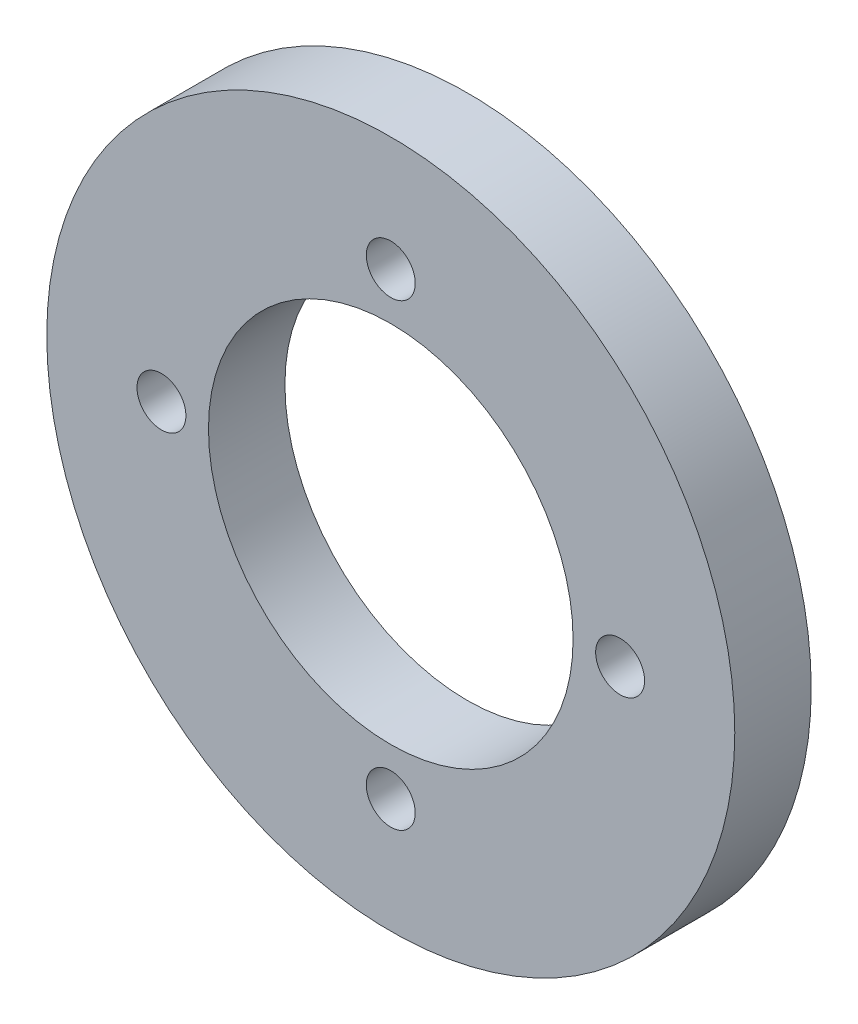
ISO-10303-21;
HEADER;
FILE_DESCRIPTION(('STEP AP214'),'2;1');
FILE_NAME('part.step','',(''),(''),'','','');
FILE_SCHEMA(('AUTOMOTIVE_DESIGN { 1 0 10303 214 1 1 1 1 }'));
ENDSEC;
DATA;
#1=APPLICATION_CONTEXT('core data for automotive mechanical design processes');
#2=APPLICATION_PROTOCOL_DEFINITION('international standard','automotive_design',2000,#1);
#3=PRODUCT_CONTEXT('',#1,'mechanical');
#4=PRODUCT('Part','Part','',(#3));
#5=PRODUCT_RELATED_PRODUCT_CATEGORY('part','',(#4));
#6=PRODUCT_DEFINITION_FORMATION('','',#4);
#7=PRODUCT_DEFINITION_CONTEXT('part definition',#1,'design');
#8=PRODUCT_DEFINITION('design','',#6,#7);
#9=PRODUCT_DEFINITION_SHAPE('','',#8);
#10=(LENGTH_UNIT() NAMED_UNIT(*) SI_UNIT(.MILLI.,.METRE.));
#11=(NAMED_UNIT(*) PLANE_ANGLE_UNIT() SI_UNIT($,.RADIAN.));
#12=(NAMED_UNIT(*) SI_UNIT($,.STERADIAN.) SOLID_ANGLE_UNIT());
#13=UNCERTAINTY_MEASURE_WITH_UNIT(LENGTH_MEASURE(1.E-05),#10,'distance_accuracy_value','');
#14=(GEOMETRIC_REPRESENTATION_CONTEXT(3) GLOBAL_UNCERTAINTY_ASSIGNED_CONTEXT((#13)) GLOBAL_UNIT_ASSIGNED_CONTEXT((#10,
#11,#12)) REPRESENTATION_CONTEXT('',''));
#15=CARTESIAN_POINT('',(0.,0.,0.));
#16=DIRECTION('',(0.,0.,1.));
#17=DIRECTION('',(1.,0.,0.));
#18=AXIS2_PLACEMENT_3D('',#15,#16,#17);
#19=CARTESIAN_POINT('',(0.,0.,5.));
#20=DIRECTION('',(0.,0.,1.));
#21=DIRECTION('',(1.,0.,0.));
#22=AXIS2_PLACEMENT_3D('',#19,#20,#21);
#23=PLANE('',#22);
#24=CARTESIAN_POINT('',(8.47140372315957E-13,-15.,5.));
#25=DIRECTION('',(0.,0.,1.));
#26=DIRECTION('',(1.,0.,0.));
#27=AXIS2_PLACEMENT_3D('',#24,#25,#26);
#28=CIRCLE('',#27,1.60000000000091);
#29=CARTESIAN_POINT('',(1.60000000000176,-15.,5.));
#30=VERTEX_POINT('',#29);
#31=EDGE_CURVE('E72',#30,#30,#28,.T.);
#32=ORIENTED_EDGE('',*,*,#31,.F.);
#33=EDGE_LOOP('',(#32));
#34=FACE_BOUND('',#33,.T.);
#35=CARTESIAN_POINT('',(0.,0.,5.));
#36=DIRECTION('',(0.,0.,1.));
#37=DIRECTION('',(1.,0.,0.));
#38=AXIS2_PLACEMENT_3D('',#35,#36,#37);
#39=CIRCLE('',#38,11.9236927152221);
#40=CARTESIAN_POINT('',(11.9236927152221,0.,5.));
#41=VERTEX_POINT('',#40);
#42=EDGE_CURVE('E56',#41,#41,#39,.T.);
#43=ORIENTED_EDGE('',*,*,#42,.F.);
#44=EDGE_LOOP('',(#43));
#45=FACE_BOUND('',#44,.T.);
#46=CARTESIAN_POINT('',(0.,0.,5.));
#47=DIRECTION('',(0.,0.,1.));
#48=DIRECTION('',(1.,0.,0.));
#49=AXIS2_PLACEMENT_3D('',#46,#47,#48);
#50=CIRCLE('',#49,22.5);
#51=CARTESIAN_POINT('',(22.5,0.,5.));
#52=VERTEX_POINT('',#51);
#53=EDGE_CURVE('E10',#52,#52,#50,.T.);
#54=ORIENTED_EDGE('',*,*,#53,.T.);
#55=EDGE_LOOP('',(#54));
#56=FACE_BOUND('',#55,.T.);
#57=CARTESIAN_POINT('',(0.,15.,5.));
#58=DIRECTION('',(0.,0.,1.));
#59=DIRECTION('',(1.,0.,0.));
#60=AXIS2_PLACEMENT_3D('',#57,#58,#59);
#61=CIRCLE('',#60,1.6);
#62=CARTESIAN_POINT('',(1.6,15.,5.));
#63=VERTEX_POINT('',#62);
#64=EDGE_CURVE('E50',#63,#63,#61,.T.);
#65=ORIENTED_EDGE('',*,*,#64,.F.);
#66=EDGE_LOOP('',(#65));
#67=FACE_BOUND('',#66,.T.);
#68=CARTESIAN_POINT('',(15.0000000000004,4.23570186157979E-13,5.));
#69=DIRECTION('',(0.,0.,1.));
#70=DIRECTION('',(1.,0.,0.));
#71=AXIS2_PLACEMENT_3D('',#68,#69,#70);
#72=CIRCLE('',#71,1.60000000000033);
#73=CARTESIAN_POINT('',(16.6000000000008,4.23570186157979E-13,5.));
#74=VERTEX_POINT('',#73);
#75=EDGE_CURVE('E64',#74,#74,#72,.T.);
#76=ORIENTED_EDGE('',*,*,#75,.F.);
#77=EDGE_LOOP('',(#76));
#78=FACE_BOUND('',#77,.T.);
#79=CARTESIAN_POINT('',(-14.9999999999996,-4.254071563567E-13,5.));
#80=DIRECTION('',(0.,0.,1.));
#81=DIRECTION('',(1.,0.,0.));
#82=AXIS2_PLACEMENT_3D('',#79,#80,#81);
#83=CIRCLE('',#82,1.60000000000068);
#84=CARTESIAN_POINT('',(-13.3999999999989,-4.254071563567E-13,5.));
#85=VERTEX_POINT('',#84);
#86=EDGE_CURVE('E80',#85,#85,#83,.T.);
#87=ORIENTED_EDGE('',*,*,#86,.F.);
#88=EDGE_LOOP('',(#87));
#89=FACE_BOUND('',#88,.T.);
#90=ADVANCED_FACE('F37',(#34,#45,#56,#67,#78,#89),#23,.T.);
#91=CARTESIAN_POINT('',(0.,0.,0.));
#92=DIRECTION('',(0.,0.,1.));
#93=DIRECTION('',(1.,0.,0.));
#94=AXIS2_PLACEMENT_3D('',#91,#92,#93);
#95=PLANE('',#94);
#96=CARTESIAN_POINT('',(0.,0.,0.));
#97=DIRECTION('',(0.,0.,1.));
#98=DIRECTION('',(1.,0.,0.));
#99=AXIS2_PLACEMENT_3D('',#96,#97,#98);
#100=CIRCLE('',#99,22.5);
#101=CARTESIAN_POINT('',(22.5,0.,0.));
#102=VERTEX_POINT('',#101);
#103=EDGE_CURVE('E41',#102,#102,#100,.T.);
#104=ORIENTED_EDGE('',*,*,#103,.F.);
#105=EDGE_LOOP('',(#104));
#106=FACE_BOUND('',#105,.T.);
#107=CARTESIAN_POINT('',(0.,15.,0.));
#108=DIRECTION('',(0.,0.,1.));
#109=DIRECTION('',(1.,0.,0.));
#110=AXIS2_PLACEMENT_3D('',#107,#108,#109);
#111=CIRCLE('',#110,1.6);
#112=CARTESIAN_POINT('',(1.6,15.,0.));
#113=VERTEX_POINT('',#112);
#114=EDGE_CURVE('E52',#113,#113,#111,.T.);
#115=ORIENTED_EDGE('',*,*,#114,.T.);
#116=EDGE_LOOP('',(#115));
#117=FACE_BOUND('',#116,.T.);
#118=CARTESIAN_POINT('',(0.,0.,0.));
#119=DIRECTION('',(0.,0.,1.));
#120=DIRECTION('',(1.,0.,0.));
#121=AXIS2_PLACEMENT_3D('',#118,#119,#120);
#122=CIRCLE('',#121,11.9236927152221);
#123=CARTESIAN_POINT('',(11.9236927152221,0.,0.));
#124=VERTEX_POINT('',#123);
#125=EDGE_CURVE('E60',#124,#124,#122,.T.);
#126=ORIENTED_EDGE('',*,*,#125,.T.);
#127=EDGE_LOOP('',(#126));
#128=FACE_BOUND('',#127,.T.);
#129=CARTESIAN_POINT('',(15.0000000000004,4.23570186157979E-13,0.));
#130=DIRECTION('',(0.,0.,1.));
#131=DIRECTION('',(1.,0.,0.));
#132=AXIS2_PLACEMENT_3D('',#129,#130,#131);
#133=CIRCLE('',#132,1.60000000000033);
#134=CARTESIAN_POINT('',(16.6000000000008,4.23570186157979E-13,0.));
#135=VERTEX_POINT('',#134);
#136=EDGE_CURVE('E68',#135,#135,#133,.T.);
#137=ORIENTED_EDGE('',*,*,#136,.T.);
#138=EDGE_LOOP('',(#137));
#139=FACE_BOUND('',#138,.T.);
#140=CARTESIAN_POINT('',(8.47140372315957E-13,-15.,0.));
#141=DIRECTION('',(0.,0.,1.));
#142=DIRECTION('',(1.,0.,0.));
#143=AXIS2_PLACEMENT_3D('',#140,#141,#142);
#144=CIRCLE('',#143,1.60000000000091);
#145=CARTESIAN_POINT('',(1.60000000000176,-15.,0.));
#146=VERTEX_POINT('',#145);
#147=EDGE_CURVE('E76',#146,#146,#144,.T.);
#148=ORIENTED_EDGE('',*,*,#147,.T.);
#149=EDGE_LOOP('',(#148));
#150=FACE_BOUND('',#149,.T.);
#151=CARTESIAN_POINT('',(-14.9999999999996,-4.254071563567E-13,0.));
#152=DIRECTION('',(0.,0.,1.));
#153=DIRECTION('',(1.,0.,0.));
#154=AXIS2_PLACEMENT_3D('',#151,#152,#153);
#155=CIRCLE('',#154,1.60000000000068);
#156=CARTESIAN_POINT('',(-13.3999999999989,-4.254071563567E-13,0.));
#157=VERTEX_POINT('',#156);
#158=EDGE_CURVE('E84',#157,#157,#155,.T.);
#159=ORIENTED_EDGE('',*,*,#158,.T.);
#160=EDGE_LOOP('',(#159));
#161=FACE_BOUND('',#160,.T.);
#162=ADVANCED_FACE('F96',(#106,#117,#128,#139,#150,#161),#95,.F.);
#163=CARTESIAN_POINT('',(0.,0.,5.));
#164=DIRECTION('',(0.,0.,-1.));
#165=DIRECTION('',(-1.,0.,0.));
#166=AXIS2_PLACEMENT_3D('',#163,#164,#165);
#167=CYLINDRICAL_SURFACE('',#166,22.5);
#168=ORIENTED_EDGE('',*,*,#53,.F.);
#169=EDGE_LOOP('',(#168));
#170=FACE_BOUND('',#169,.T.);
#171=ORIENTED_EDGE('',*,*,#103,.T.);
#172=EDGE_LOOP('',(#171));
#173=FACE_BOUND('',#172,.T.);
#174=ADVANCED_FACE('F39',(#170,#173),#167,.T.);
#175=CARTESIAN_POINT('',(0.,15.,5.));
#176=DIRECTION('',(0.,0.,-1.));
#177=DIRECTION('',(-1.,0.,0.));
#178=AXIS2_PLACEMENT_3D('',#175,#176,#177);
#179=CYLINDRICAL_SURFACE('',#178,1.6);
#180=ORIENTED_EDGE('',*,*,#64,.T.);
#181=EDGE_LOOP('',(#180));
#182=FACE_BOUND('',#181,.T.);
#183=ORIENTED_EDGE('',*,*,#114,.F.);
#184=EDGE_LOOP('',(#183));
#185=FACE_BOUND('',#184,.T.);
#186=ADVANCED_FACE('F106',(#182,#185),#179,.F.);
#187=CARTESIAN_POINT('',(0.,0.,5.));
#188=DIRECTION('',(0.,0.,-1.));
#189=DIRECTION('',(-1.,0.,0.));
#190=AXIS2_PLACEMENT_3D('',#187,#188,#189);
#191=CYLINDRICAL_SURFACE('',#190,11.9236927152221);
#192=ORIENTED_EDGE('',*,*,#42,.T.);
#193=EDGE_LOOP('',(#192));
#194=FACE_BOUND('',#193,.T.);
#195=ORIENTED_EDGE('',*,*,#125,.F.);
#196=EDGE_LOOP('',(#195));
#197=FACE_BOUND('',#196,.T.);
#198=ADVANCED_FACE('F109',(#194,#197),#191,.F.);
#199=CARTESIAN_POINT('',(15.0000000000004,4.23570186157979E-13,5.));
#200=DIRECTION('',(0.,0.,-1.));
#201=DIRECTION('',(-1.,0.,0.));
#202=AXIS2_PLACEMENT_3D('',#199,#200,#201);
#203=CYLINDRICAL_SURFACE('',#202,1.60000000000033);
#204=ORIENTED_EDGE('',*,*,#75,.T.);
#205=EDGE_LOOP('',(#204));
#206=FACE_BOUND('',#205,.T.);
#207=ORIENTED_EDGE('',*,*,#136,.F.);
#208=EDGE_LOOP('',(#207));
#209=FACE_BOUND('',#208,.T.);
#210=ADVANCED_FACE('F113',(#206,#209),#203,.F.);
#211=CARTESIAN_POINT('',(8.47140372315957E-13,-15.,5.));
#212=DIRECTION('',(0.,0.,-1.));
#213=DIRECTION('',(-1.,0.,0.));
#214=AXIS2_PLACEMENT_3D('',#211,#212,#213);
#215=CYLINDRICAL_SURFACE('',#214,1.60000000000091);
#216=ORIENTED_EDGE('',*,*,#31,.T.);
#217=EDGE_LOOP('',(#216));
#218=FACE_BOUND('',#217,.T.);
#219=ORIENTED_EDGE('',*,*,#147,.F.);
#220=EDGE_LOOP('',(#219));
#221=FACE_BOUND('',#220,.T.);
#222=ADVANCED_FACE('F117',(#218,#221),#215,.F.);
#223=CARTESIAN_POINT('',(-14.9999999999996,-4.254071563567E-13,5.));
#224=DIRECTION('',(0.,0.,-1.));
#225=DIRECTION('',(-1.,0.,0.));
#226=AXIS2_PLACEMENT_3D('',#223,#224,#225);
#227=CYLINDRICAL_SURFACE('',#226,1.60000000000068);
#228=ORIENTED_EDGE('',*,*,#86,.T.);
#229=EDGE_LOOP('',(#228));
#230=FACE_BOUND('',#229,.T.);
#231=ORIENTED_EDGE('',*,*,#158,.F.);
#232=EDGE_LOOP('',(#231));
#233=FACE_BOUND('',#232,.T.);
#234=ADVANCED_FACE('F92',(#230,#233),#227,.F.);
#235=CLOSED_SHELL('',(#90,#162,#174,#186,#198,#210,#222,#234));
#236=MANIFOLD_SOLID_BREP('B2',#235);
#237=ADVANCED_BREP_SHAPE_REPRESENTATION('',(#18,#236),#14);
#238=SHAPE_DEFINITION_REPRESENTATION(#9,#237);
ENDSEC;
END-ISO-10303-21;
